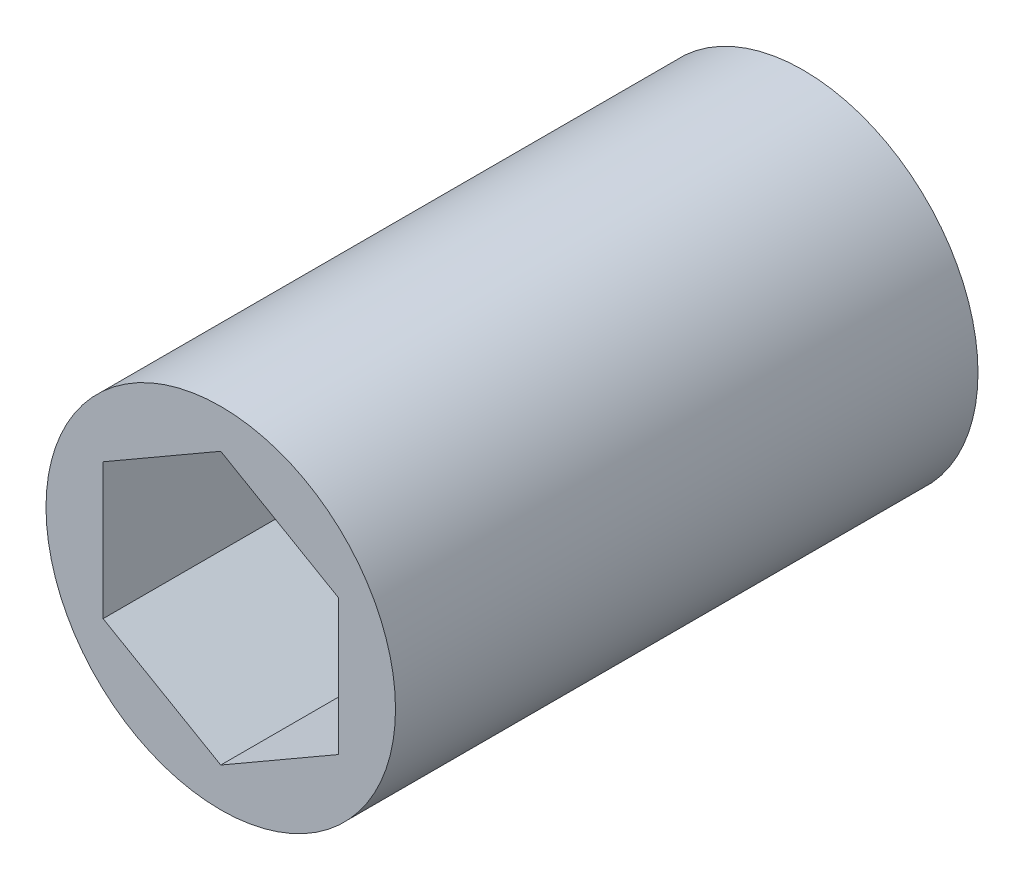
ISO-10303-21;
HEADER;
FILE_DESCRIPTION(('STEP AP214'),'2;1');
FILE_NAME('part.step','',(''),(''),'','','');
FILE_SCHEMA(('AUTOMOTIVE_DESIGN { 1 0 10303 214 1 1 1 1 }'));
ENDSEC;
DATA;
#1=APPLICATION_CONTEXT('core data for automotive mechanical design processes');
#2=APPLICATION_PROTOCOL_DEFINITION('international standard','automotive_design',2000,#1);
#3=PRODUCT_CONTEXT('',#1,'mechanical');
#4=PRODUCT('Part','Part','',(#3));
#5=PRODUCT_RELATED_PRODUCT_CATEGORY('part','',(#4));
#6=PRODUCT_DEFINITION_FORMATION('','',#4);
#7=PRODUCT_DEFINITION_CONTEXT('part definition',#1,'design');
#8=PRODUCT_DEFINITION('design','',#6,#7);
#9=PRODUCT_DEFINITION_SHAPE('','',#8);
#10=(LENGTH_UNIT() NAMED_UNIT(*) SI_UNIT(.MILLI.,.METRE.));
#11=(NAMED_UNIT(*) PLANE_ANGLE_UNIT() SI_UNIT($,.RADIAN.));
#12=(NAMED_UNIT(*) SI_UNIT($,.STERADIAN.) SOLID_ANGLE_UNIT());
#13=UNCERTAINTY_MEASURE_WITH_UNIT(LENGTH_MEASURE(1.E-05),#10,'distance_accuracy_value','');
#14=(GEOMETRIC_REPRESENTATION_CONTEXT(3) GLOBAL_UNCERTAINTY_ASSIGNED_CONTEXT((#13)) GLOBAL_UNIT_ASSIGNED_CONTEXT((#10,
#11,#12)) REPRESENTATION_CONTEXT('',''));
#15=CARTESIAN_POINT('',(0.,0.,0.));
#16=DIRECTION('',(0.,0.,1.));
#17=DIRECTION('',(1.,0.,0.));
#18=AXIS2_PLACEMENT_3D('',#15,#16,#17);
#19=CARTESIAN_POINT('',(0.,0.,31.75));
#20=DIRECTION('',(0.,0.,1.));
#21=DIRECTION('',(1.,0.,0.));
#22=AXIS2_PLACEMENT_3D('',#19,#20,#21);
#23=PLANE('',#22);
#24=CARTESIAN_POINT('',(0.,0.,31.75));
#25=DIRECTION('',(0.,0.,1.));
#26=DIRECTION('',(1.,0.,0.));
#27=AXIS2_PLACEMENT_3D('',#24,#25,#26);
#28=CIRCLE('',#27,9.525);
#29=CARTESIAN_POINT('',(9.525,0.,31.75));
#30=VERTEX_POINT('',#29);
#31=EDGE_CURVE('E11',#30,#30,#28,.T.);
#32=ORIENTED_EDGE('',*,*,#31,.T.);
#33=EDGE_LOOP('',(#32));
#34=FACE_BOUND('',#33,.T.);
#35=DIRECTION('',(-0.866025403784439,0.5,0.));
#36=VECTOR('',#35,1.);
#37=CARTESIAN_POINT('',(6.4135,3.70283595144767,31.75));
#38=LINE('',#37,#36);
#39=CARTESIAN_POINT('',(6.4135,3.70283595144767,31.75));
#40=VERTEX_POINT('',#39);
#41=CARTESIAN_POINT('',(0.,7.40567190289533,31.75));
#42=VERTEX_POINT('',#41);
#43=EDGE_CURVE('E112',#40,#42,#38,.T.);
#44=ORIENTED_EDGE('',*,*,#43,.F.);
#45=DIRECTION('',(0.,1.,0.));
#46=VECTOR('',#45,1.);
#47=CARTESIAN_POINT('',(6.4135,-3.70283595144767,31.75));
#48=LINE('',#47,#46);
#49=CARTESIAN_POINT('',(6.4135,-3.70283595144767,31.75));
#50=VERTEX_POINT('',#49);
#51=EDGE_CURVE('E103',#50,#40,#48,.T.);
#52=ORIENTED_EDGE('',*,*,#51,.F.);
#53=DIRECTION('',(0.866025403784439,0.5,0.));
#54=VECTOR('',#53,1.);
#55=CARTESIAN_POINT('',(0.,-7.40567190289533,31.75));
#56=LINE('',#55,#54);
#57=CARTESIAN_POINT('',(0.,-7.40567190289533,31.75));
#58=VERTEX_POINT('',#57);
#59=EDGE_CURVE('E137',#58,#50,#56,.T.);
#60=ORIENTED_EDGE('',*,*,#59,.F.);
#61=DIRECTION('',(0.866025403784439,-0.5,0.));
#62=VECTOR('',#61,1.);
#63=CARTESIAN_POINT('',(-6.4135,-3.70283595144767,31.75));
#64=LINE('',#63,#62);
#65=CARTESIAN_POINT('',(-6.4135,-3.70283595144767,31.75));
#66=VERTEX_POINT('',#65);
#67=EDGE_CURVE('E134',#66,#58,#64,.T.);
#68=ORIENTED_EDGE('',*,*,#67,.F.);
#69=DIRECTION('',(0.,-1.,0.));
#70=VECTOR('',#69,1.);
#71=CARTESIAN_POINT('',(-6.4135,3.70283595144767,31.75));
#72=LINE('',#71,#70);
#73=CARTESIAN_POINT('',(-6.4135,3.70283595144767,31.75));
#74=VERTEX_POINT('',#73);
#75=EDGE_CURVE('E129',#74,#66,#72,.T.);
#76=ORIENTED_EDGE('',*,*,#75,.F.);
#77=DIRECTION('',(-0.866025403784439,-0.5,0.));
#78=VECTOR('',#77,1.);
#79=CARTESIAN_POINT('',(0.,7.40567190289533,31.75));
#80=LINE('',#79,#78);
#81=EDGE_CURVE('E125',#42,#74,#80,.T.);
#82=ORIENTED_EDGE('',*,*,#81,.F.);
#83=EDGE_LOOP('',(#44,#52,#60,#68,#76,#82));
#84=FACE_BOUND('',#83,.T.);
#85=ADVANCED_FACE('F49',(#34,#84),#23,.T.);
#86=CARTESIAN_POINT('',(0.,0.,0.));
#87=DIRECTION('',(0.,0.,1.));
#88=DIRECTION('',(1.,0.,0.));
#89=AXIS2_PLACEMENT_3D('',#86,#87,#88);
#90=PLANE('',#89);
#91=CARTESIAN_POINT('',(0.,0.,0.));
#92=DIRECTION('',(0.,0.,1.));
#93=DIRECTION('',(1.,0.,0.));
#94=AXIS2_PLACEMENT_3D('',#91,#92,#93);
#95=CIRCLE('',#94,9.525);
#96=CARTESIAN_POINT('',(9.525,0.,0.));
#97=VERTEX_POINT('',#96);
#98=EDGE_CURVE('E53',#97,#97,#95,.T.);
#99=ORIENTED_EDGE('',*,*,#98,.F.);
#100=EDGE_LOOP('',(#99));
#101=FACE_BOUND('',#100,.T.);
#102=DIRECTION('',(0.,1.,0.));
#103=VECTOR('',#102,1.);
#104=CARTESIAN_POINT('',(6.4135,-3.70283595144767,0.));
#105=LINE('',#104,#103);
#106=CARTESIAN_POINT('',(6.4135,-3.70283595144767,0.));
#107=VERTEX_POINT('',#106);
#108=CARTESIAN_POINT('',(6.4135,3.70283595144767,0.));
#109=VERTEX_POINT('',#108);
#110=EDGE_CURVE('E73',#107,#109,#105,.T.);
#111=ORIENTED_EDGE('',*,*,#110,.T.);
#112=DIRECTION('',(-0.866025403784439,0.5,0.));
#113=VECTOR('',#112,1.);
#114=CARTESIAN_POINT('',(6.4135,3.70283595144767,0.));
#115=LINE('',#114,#113);
#116=CARTESIAN_POINT('',(0.,7.40567190289533,0.));
#117=VERTEX_POINT('',#116);
#118=EDGE_CURVE('E119',#109,#117,#115,.T.);
#119=ORIENTED_EDGE('',*,*,#118,.T.);
#120=DIRECTION('',(-0.866025403784439,-0.5,0.));
#121=VECTOR('',#120,1.);
#122=CARTESIAN_POINT('',(0.,7.40567190289533,0.));
#123=LINE('',#122,#121);
#124=CARTESIAN_POINT('',(-6.4135,3.70283595144767,0.));
#125=VERTEX_POINT('',#124);
#126=EDGE_CURVE('E144',#117,#125,#123,.T.);
#127=ORIENTED_EDGE('',*,*,#126,.T.);
#128=DIRECTION('',(0.,-1.,0.));
#129=VECTOR('',#128,1.);
#130=CARTESIAN_POINT('',(-6.4135,3.70283595144767,0.));
#131=LINE('',#130,#129);
#132=CARTESIAN_POINT('',(-6.4135,-3.70283595144767,0.));
#133=VERTEX_POINT('',#132);
#134=EDGE_CURVE('E148',#125,#133,#131,.T.);
#135=ORIENTED_EDGE('',*,*,#134,.T.);
#136=DIRECTION('',(0.866025403784439,-0.5,0.));
#137=VECTOR('',#136,1.);
#138=CARTESIAN_POINT('',(-6.4135,-3.70283595144767,0.));
#139=LINE('',#138,#137);
#140=CARTESIAN_POINT('',(0.,-7.40567190289533,0.));
#141=VERTEX_POINT('',#140);
#142=EDGE_CURVE('E152',#133,#141,#139,.T.);
#143=ORIENTED_EDGE('',*,*,#142,.T.);
#144=DIRECTION('',(0.866025403784439,0.5,0.));
#145=VECTOR('',#144,1.);
#146=CARTESIAN_POINT('',(0.,-7.40567190289533,0.));
#147=LINE('',#146,#145);
#148=EDGE_CURVE('E113',#141,#107,#147,.T.);
#149=ORIENTED_EDGE('',*,*,#148,.T.);
#150=EDGE_LOOP('',(#111,#119,#127,#135,#143,#149));
#151=FACE_BOUND('',#150,.T.);
#152=ADVANCED_FACE('F176',(#101,#151),#90,.F.);
#153=CARTESIAN_POINT('',(0.,0.,31.75));
#154=DIRECTION('',(0.,0.,-1.));
#155=DIRECTION('',(-1.,0.,0.));
#156=AXIS2_PLACEMENT_3D('',#153,#154,#155);
#157=CYLINDRICAL_SURFACE('',#156,9.525);
#158=ORIENTED_EDGE('',*,*,#31,.F.);
#159=EDGE_LOOP('',(#158));
#160=FACE_BOUND('',#159,.T.);
#161=ORIENTED_EDGE('',*,*,#98,.T.);
#162=EDGE_LOOP('',(#161));
#163=FACE_BOUND('',#162,.T.);
#164=ADVANCED_FACE('F51',(#160,#163),#157,.T.);
#165=CARTESIAN_POINT('',(6.4135,-3.70283595144767,31.75));
#166=DIRECTION('',(-1.,0.,0.));
#167=DIRECTION('',(0.,-1.,0.));
#168=AXIS2_PLACEMENT_3D('',#165,#166,#167);
#169=PLANE('',#168);
#170=ORIENTED_EDGE('',*,*,#110,.F.);
#171=DIRECTION('',(0.,0.,-1.));
#172=VECTOR('',#171,1.);
#173=CARTESIAN_POINT('',(6.4135,-3.70283595144767,31.75));
#174=LINE('',#173,#172);
#175=EDGE_CURVE('E107',#50,#107,#174,.T.);
#176=ORIENTED_EDGE('',*,*,#175,.F.);
#177=ORIENTED_EDGE('',*,*,#51,.T.);
#178=DIRECTION('',(0.,0.,-1.));
#179=VECTOR('',#178,1.);
#180=CARTESIAN_POINT('',(6.4135,3.70283595144767,31.75));
#181=LINE('',#180,#179);
#182=EDGE_CURVE('E106',#40,#109,#181,.T.);
#183=ORIENTED_EDGE('',*,*,#182,.T.);
#184=EDGE_LOOP('',(#170,#176,#177,#183));
#185=FACE_BOUND('',#184,.T.);
#186=ADVANCED_FACE('F105',(#185),#169,.T.);
#187=CARTESIAN_POINT('',(6.4135,3.70283595144767,31.75));
#188=DIRECTION('',(-0.5,-0.866025403784439,0.));
#189=DIRECTION('',(0.866025403784439,-0.5,0.));
#190=AXIS2_PLACEMENT_3D('',#187,#188,#189);
#191=PLANE('',#190);
#192=ORIENTED_EDGE('',*,*,#118,.F.);
#193=ORIENTED_EDGE('',*,*,#182,.F.);
#194=ORIENTED_EDGE('',*,*,#43,.T.);
#195=DIRECTION('',(0.,0.,-1.));
#196=VECTOR('',#195,1.);
#197=CARTESIAN_POINT('',(0.,7.40567190289533,31.75));
#198=LINE('',#197,#196);
#199=EDGE_CURVE('E121',#42,#117,#198,.T.);
#200=ORIENTED_EDGE('',*,*,#199,.T.);
#201=EDGE_LOOP('',(#192,#193,#194,#200));
#202=FACE_BOUND('',#201,.T.);
#203=ADVANCED_FACE('F116',(#202),#191,.T.);
#204=CARTESIAN_POINT('',(0.,7.40567190289533,31.75));
#205=DIRECTION('',(0.5,-0.866025403784439,0.));
#206=DIRECTION('',(0.866025403784439,0.5,0.));
#207=AXIS2_PLACEMENT_3D('',#204,#205,#206);
#208=PLANE('',#207);
#209=ORIENTED_EDGE('',*,*,#126,.F.);
#210=ORIENTED_EDGE('',*,*,#199,.F.);
#211=ORIENTED_EDGE('',*,*,#81,.T.);
#212=DIRECTION('',(0.,0.,-1.));
#213=VECTOR('',#212,1.);
#214=CARTESIAN_POINT('',(-6.4135,3.70283595144767,31.75));
#215=LINE('',#214,#213);
#216=EDGE_CURVE('E166',#74,#125,#215,.T.);
#217=ORIENTED_EDGE('',*,*,#216,.T.);
#218=EDGE_LOOP('',(#209,#210,#211,#217));
#219=FACE_BOUND('',#218,.T.);
#220=ADVANCED_FACE('F172',(#219),#208,.T.);
#221=CARTESIAN_POINT('',(-6.4135,3.70283595144767,31.75));
#222=DIRECTION('',(1.,0.,0.));
#223=DIRECTION('',(0.,1.,0.));
#224=AXIS2_PLACEMENT_3D('',#221,#222,#223);
#225=PLANE('',#224);
#226=ORIENTED_EDGE('',*,*,#134,.F.);
#227=ORIENTED_EDGE('',*,*,#216,.F.);
#228=ORIENTED_EDGE('',*,*,#75,.T.);
#229=DIRECTION('',(0.,0.,-1.));
#230=VECTOR('',#229,1.);
#231=CARTESIAN_POINT('',(-6.4135,-3.70283595144767,31.75));
#232=LINE('',#231,#230);
#233=EDGE_CURVE('E163',#66,#133,#232,.T.);
#234=ORIENTED_EDGE('',*,*,#233,.T.);
#235=EDGE_LOOP('',(#226,#227,#228,#234));
#236=FACE_BOUND('',#235,.T.);
#237=ADVANCED_FACE('F184',(#236),#225,.T.);
#238=CARTESIAN_POINT('',(-6.4135,-3.70283595144767,31.75));
#239=DIRECTION('',(0.5,0.866025403784439,0.));
#240=DIRECTION('',(-0.866025403784439,0.5,0.));
#241=AXIS2_PLACEMENT_3D('',#238,#239,#240);
#242=PLANE('',#241);
#243=ORIENTED_EDGE('',*,*,#142,.F.);
#244=ORIENTED_EDGE('',*,*,#233,.F.);
#245=ORIENTED_EDGE('',*,*,#67,.T.);
#246=DIRECTION('',(0.,0.,-1.));
#247=VECTOR('',#246,1.);
#248=CARTESIAN_POINT('',(0.,-7.40567190289533,31.75));
#249=LINE('',#248,#247);
#250=EDGE_CURVE('E65',#58,#141,#249,.T.);
#251=ORIENTED_EDGE('',*,*,#250,.T.);
#252=EDGE_LOOP('',(#243,#244,#245,#251));
#253=FACE_BOUND('',#252,.T.);
#254=ADVANCED_FACE('F182',(#253),#242,.T.);
#255=CARTESIAN_POINT('',(0.,-7.40567190289533,31.75));
#256=DIRECTION('',(-0.5,0.866025403784439,0.));
#257=DIRECTION('',(-0.866025403784439,-0.5,0.));
#258=AXIS2_PLACEMENT_3D('',#255,#256,#257);
#259=PLANE('',#258);
#260=ORIENTED_EDGE('',*,*,#148,.F.);
#261=ORIENTED_EDGE('',*,*,#250,.F.);
#262=ORIENTED_EDGE('',*,*,#59,.T.);
#263=ORIENTED_EDGE('',*,*,#175,.T.);
#264=EDGE_LOOP('',(#260,#261,#262,#263));
#265=FACE_BOUND('',#264,.T.);
#266=ADVANCED_FACE('F178',(#265),#259,.T.);
#267=CLOSED_SHELL('',(#85,#152,#164,#186,#203,#220,#237,#254,#266));
#268=MANIFOLD_SOLID_BREP('B2',#267);
#269=ADVANCED_BREP_SHAPE_REPRESENTATION('',(#18,#268),#14);
#270=SHAPE_DEFINITION_REPRESENTATION(#9,#269);
ENDSEC;
END-ISO-10303-21;
